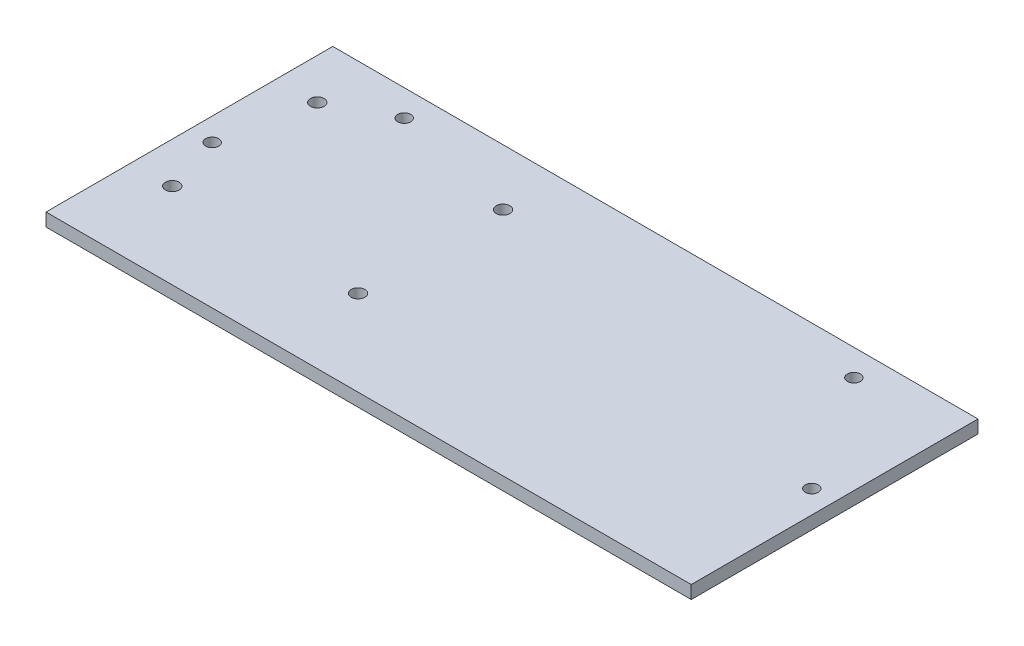
ISO-10303-21;
HEADER;
FILE_DESCRIPTION(('STEP AP214'),'2;1');
FILE_NAME('part.step','',(''),(''),'','','');
FILE_SCHEMA(('AUTOMOTIVE_DESIGN { 1 0 10303 214 1 1 1 1 }'));
ENDSEC;
DATA;
#1=APPLICATION_CONTEXT('core data for automotive mechanical design processes');
#2=APPLICATION_PROTOCOL_DEFINITION('international standard','automotive_design',2000,#1);
#3=PRODUCT_CONTEXT('',#1,'mechanical');
#4=PRODUCT('Part','Part','',(#3));
#5=PRODUCT_RELATED_PRODUCT_CATEGORY('part','',(#4));
#6=PRODUCT_DEFINITION_FORMATION('','',#4);
#7=PRODUCT_DEFINITION_CONTEXT('part definition',#1,'design');
#8=PRODUCT_DEFINITION('design','',#6,#7);
#9=PRODUCT_DEFINITION_SHAPE('','',#8);
#10=(LENGTH_UNIT() NAMED_UNIT(*) SI_UNIT(.MILLI.,.METRE.));
#11=(NAMED_UNIT(*) PLANE_ANGLE_UNIT() SI_UNIT($,.RADIAN.));
#12=(NAMED_UNIT(*) SI_UNIT($,.STERADIAN.) SOLID_ANGLE_UNIT());
#13=UNCERTAINTY_MEASURE_WITH_UNIT(LENGTH_MEASURE(1.E-05),#10,'distance_accuracy_value','');
#14=(GEOMETRIC_REPRESENTATION_CONTEXT(3) GLOBAL_UNCERTAINTY_ASSIGNED_CONTEXT((#13)) GLOBAL_UNIT_ASSIGNED_CONTEXT((#10,
#11,#12)) REPRESENTATION_CONTEXT('',''));
#15=CARTESIAN_POINT('',(0.,0.,0.));
#16=DIRECTION('',(0.,0.,1.));
#17=DIRECTION('',(1.,0.,0.));
#18=AXIS2_PLACEMENT_3D('',#15,#16,#17);
#19=CARTESIAN_POINT('',(0.,4.,0.));
#20=DIRECTION('',(1.,0.,0.));
#21=DIRECTION('',(0.,0.,-1.));
#22=AXIS2_PLACEMENT_3D('',#19,#20,#21);
#23=PLANE('',#22);
#24=DIRECTION('',(0.,0.,1.));
#25=VECTOR('',#24,1.);
#26=CARTESIAN_POINT('',(0.,0.,0.));
#27=LINE('',#26,#25);
#28=CARTESIAN_POINT('',(0.,0.,-88.));
#29=VERTEX_POINT('',#28);
#30=CARTESIAN_POINT('',(0.,0.,0.));
#31=VERTEX_POINT('',#30);
#32=EDGE_CURVE('E109',#29,#31,#27,.T.);
#33=ORIENTED_EDGE('',*,*,#32,.T.);
#34=DIRECTION('',(0.,-1.,0.));
#35=VECTOR('',#34,1.);
#36=CARTESIAN_POINT('',(0.,4.,0.));
#37=LINE('',#36,#35);
#38=CARTESIAN_POINT('',(0.,4.,0.));
#39=VERTEX_POINT('',#38);
#40=EDGE_CURVE('E13',#39,#31,#37,.T.);
#41=ORIENTED_EDGE('',*,*,#40,.F.);
#42=DIRECTION('',(0.,0.,1.));
#43=VECTOR('',#42,1.);
#44=CARTESIAN_POINT('',(0.,4.,0.));
#45=LINE('',#44,#43);
#46=CARTESIAN_POINT('',(0.,4.,-88.));
#47=VERTEX_POINT('',#46);
#48=EDGE_CURVE('E97',#47,#39,#45,.T.);
#49=ORIENTED_EDGE('',*,*,#48,.F.);
#50=DIRECTION('',(0.,-1.,0.));
#51=VECTOR('',#50,1.);
#52=CARTESIAN_POINT('',(0.,4.,-88.));
#53=LINE('',#52,#51);
#54=EDGE_CURVE('E105',#47,#29,#53,.T.);
#55=ORIENTED_EDGE('',*,*,#54,.T.);
#56=EDGE_LOOP('',(#33,#41,#49,#55));
#57=FACE_BOUND('',#56,.T.);
#58=ADVANCED_FACE('F46',(#57),#23,.F.);
#59=CARTESIAN_POINT('',(0.,4.,0.));
#60=DIRECTION('',(0.,0.,-1.));
#61=DIRECTION('',(-1.,0.,0.));
#62=AXIS2_PLACEMENT_3D('',#59,#60,#61);
#63=PLANE('',#62);
#64=DIRECTION('',(1.,0.,0.));
#65=VECTOR('',#64,1.);
#66=CARTESIAN_POINT('',(0.,0.,0.));
#67=LINE('',#66,#65);
#68=CARTESIAN_POINT('',(198.,0.,0.));
#69=VERTEX_POINT('',#68);
#70=EDGE_CURVE('E101',#31,#69,#67,.T.);
#71=ORIENTED_EDGE('',*,*,#70,.T.);
#72=DIRECTION('',(0.,-1.,0.));
#73=VECTOR('',#72,1.);
#74=CARTESIAN_POINT('',(198.,4.,0.));
#75=LINE('',#74,#73);
#76=CARTESIAN_POINT('',(198.,4.,0.));
#77=VERTEX_POINT('',#76);
#78=EDGE_CURVE('E54',#77,#69,#75,.T.);
#79=ORIENTED_EDGE('',*,*,#78,.F.);
#80=DIRECTION('',(1.,0.,0.));
#81=VECTOR('',#80,1.);
#82=CARTESIAN_POINT('',(0.,4.,0.));
#83=LINE('',#82,#81);
#84=EDGE_CURVE('E92',#39,#77,#83,.T.);
#85=ORIENTED_EDGE('',*,*,#84,.F.);
#86=ORIENTED_EDGE('',*,*,#40,.T.);
#87=EDGE_LOOP('',(#71,#79,#85,#86));
#88=FACE_BOUND('',#87,.T.);
#89=ADVANCED_FACE('F100',(#88),#63,.F.);
#90=CARTESIAN_POINT('',(198.,4.,0.));
#91=DIRECTION('',(-1.,0.,0.));
#92=DIRECTION('',(0.,0.,1.));
#93=AXIS2_PLACEMENT_3D('',#90,#91,#92);
#94=PLANE('',#93);
#95=DIRECTION('',(0.,0.,-1.));
#96=VECTOR('',#95,1.);
#97=CARTESIAN_POINT('',(198.,0.,0.));
#98=LINE('',#97,#96);
#99=CARTESIAN_POINT('',(198.,0.,-88.));
#100=VERTEX_POINT('',#99);
#101=EDGE_CURVE('E79',#69,#100,#98,.T.);
#102=ORIENTED_EDGE('',*,*,#101,.T.);
#103=DIRECTION('',(0.,-1.,0.));
#104=VECTOR('',#103,1.);
#105=CARTESIAN_POINT('',(198.,4.,-88.));
#106=LINE('',#105,#104);
#107=CARTESIAN_POINT('',(198.,4.,-88.));
#108=VERTEX_POINT('',#107);
#109=EDGE_CURVE('E102',#108,#100,#106,.T.);
#110=ORIENTED_EDGE('',*,*,#109,.F.);
#111=DIRECTION('',(0.,0.,-1.));
#112=VECTOR('',#111,1.);
#113=CARTESIAN_POINT('',(198.,4.,0.));
#114=LINE('',#113,#112);
#115=EDGE_CURVE('E95',#77,#108,#114,.T.);
#116=ORIENTED_EDGE('',*,*,#115,.F.);
#117=ORIENTED_EDGE('',*,*,#78,.T.);
#118=EDGE_LOOP('',(#102,#110,#116,#117));
#119=FACE_BOUND('',#118,.T.);
#120=ADVANCED_FACE('F103',(#119),#94,.F.);
#121=CARTESIAN_POINT('',(0.,4.,-88.));
#122=DIRECTION('',(0.,0.,1.));
#123=DIRECTION('',(1.,0.,0.));
#124=AXIS2_PLACEMENT_3D('',#121,#122,#123);
#125=PLANE('',#124);
#126=DIRECTION('',(-1.,0.,0.));
#127=VECTOR('',#126,1.);
#128=CARTESIAN_POINT('',(0.,0.,-88.));
#129=LINE('',#128,#127);
#130=EDGE_CURVE('E85',#100,#29,#129,.T.);
#131=ORIENTED_EDGE('',*,*,#130,.T.);
#132=ORIENTED_EDGE('',*,*,#54,.F.);
#133=DIRECTION('',(-1.,0.,0.));
#134=VECTOR('',#133,1.);
#135=CARTESIAN_POINT('',(0.,4.,-88.));
#136=LINE('',#135,#134);
#137=EDGE_CURVE('E62',#108,#47,#136,.T.);
#138=ORIENTED_EDGE('',*,*,#137,.F.);
#139=ORIENTED_EDGE('',*,*,#109,.T.);
#140=EDGE_LOOP('',(#131,#132,#138,#139));
#141=FACE_BOUND('',#140,.T.);
#142=ADVANCED_FACE('F117',(#141),#125,.F.);
#143=CARTESIAN_POINT('',(0.,4.,0.));
#144=DIRECTION('',(0.,-1.,0.));
#145=DIRECTION('',(0.,0.,-1.));
#146=AXIS2_PLACEMENT_3D('',#143,#144,#145);
#147=PLANE('',#146);
#148=CARTESIAN_POINT('',(191.,4.,-44.));
#149=DIRECTION('',(0.,-1.,0.));
#150=DIRECTION('',(0.,0.,-1.));
#151=AXIS2_PLACEMENT_3D('',#148,#149,#150);
#152=CIRCLE('',#151,2.);
#153=CARTESIAN_POINT('',(191.,4.,-46.));
#154=VERTEX_POINT('',#153);
#155=EDGE_CURVE('E164',#154,#154,#152,.T.);
#156=ORIENTED_EDGE('',*,*,#155,.T.);
#157=EDGE_LOOP('',(#156));
#158=FACE_BOUND('',#157,.T.);
#159=CARTESIAN_POINT('',(7.,4.,-44.));
#160=DIRECTION('',(0.,-1.,0.));
#161=DIRECTION('',(0.,0.,-1.));
#162=AXIS2_PLACEMENT_3D('',#159,#160,#161);
#163=CIRCLE('',#162,2.00000000000001);
#164=CARTESIAN_POINT('',(7.,4.,-46.));
#165=VERTEX_POINT('',#164);
#166=EDGE_CURVE('E158',#165,#165,#163,.T.);
#167=ORIENTED_EDGE('',*,*,#166,.T.);
#168=EDGE_LOOP('',(#167));
#169=FACE_BOUND('',#168,.T.);
#170=CARTESIAN_POINT('',(168.,4.,-79.9153384304878));
#171=DIRECTION('',(0.,-1.,0.));
#172=DIRECTION('',(0.,0.,-1.));
#173=AXIS2_PLACEMENT_3D('',#170,#171,#172);
#174=CIRCLE('',#173,2.);
#175=CARTESIAN_POINT('',(168.,4.,-81.9153384304878));
#176=VERTEX_POINT('',#175);
#177=EDGE_CURVE('E152',#176,#176,#174,.T.);
#178=ORIENTED_EDGE('',*,*,#177,.T.);
#179=EDGE_LOOP('',(#178));
#180=FACE_BOUND('',#179,.T.);
#181=CARTESIAN_POINT('',(30.,4.,-79.9153384304878));
#182=DIRECTION('',(0.,-1.,0.));
#183=DIRECTION('',(0.,0.,-1.));
#184=AXIS2_PLACEMENT_3D('',#181,#182,#183);
#185=CIRCLE('',#184,2.);
#186=CARTESIAN_POINT('',(30.,4.,-81.9153384304878));
#187=VERTEX_POINT('',#186);
#188=EDGE_CURVE('E133',#187,#187,#185,.T.);
#189=ORIENTED_EDGE('',*,*,#188,.T.);
#190=EDGE_LOOP('',(#189));
#191=FACE_BOUND('',#190,.T.);
#192=CARTESIAN_POINT('',(69.5,4.,-26.25));
#193=DIRECTION('',(0.,-1.,0.));
#194=DIRECTION('',(0.,0.,-1.));
#195=AXIS2_PLACEMENT_3D('',#192,#193,#194);
#196=CIRCLE('',#195,2.09999999999999);
#197=CARTESIAN_POINT('',(69.5,4.,-28.35));
#198=VERTEX_POINT('',#197);
#199=EDGE_CURVE('E126',#198,#198,#196,.T.);
#200=ORIENTED_EDGE('',*,*,#199,.T.);
#201=EDGE_LOOP('',(#200));
#202=FACE_BOUND('',#201,.T.);
#203=CARTESIAN_POINT('',(69.5,4.,-70.75));
#204=DIRECTION('',(0.,-1.,0.));
#205=DIRECTION('',(0.,0.,-1.));
#206=AXIS2_PLACEMENT_3D('',#203,#204,#205);
#207=CIRCLE('',#206,2.09999999999999);
#208=CARTESIAN_POINT('',(69.5,4.,-72.85));
#209=VERTEX_POINT('',#208);
#210=EDGE_CURVE('E139',#209,#209,#207,.T.);
#211=ORIENTED_EDGE('',*,*,#210,.T.);
#212=EDGE_LOOP('',(#211));
#213=FACE_BOUND('',#212,.T.);
#214=CARTESIAN_POINT('',(12.5,4.,-70.75));
#215=DIRECTION('',(0.,-1.,0.));
#216=DIRECTION('',(0.,0.,-1.));
#217=AXIS2_PLACEMENT_3D('',#214,#215,#216);
#218=CIRCLE('',#217,2.1);
#219=CARTESIAN_POINT('',(12.5,4.,-72.85));
#220=VERTEX_POINT('',#219);
#221=EDGE_CURVE('E132',#220,#220,#218,.T.);
#222=ORIENTED_EDGE('',*,*,#221,.T.);
#223=EDGE_LOOP('',(#222));
#224=FACE_BOUND('',#223,.T.);
#225=CARTESIAN_POINT('',(12.5,4.,-26.25));
#226=DIRECTION('',(0.,-1.,0.));
#227=DIRECTION('',(0.,0.,-1.));
#228=AXIS2_PLACEMENT_3D('',#225,#226,#227);
#229=CIRCLE('',#228,2.1);
#230=CARTESIAN_POINT('',(12.5,4.,-28.35));
#231=VERTEX_POINT('',#230);
#232=EDGE_CURVE('E112',#231,#231,#229,.T.);
#233=ORIENTED_EDGE('',*,*,#232,.T.);
#234=EDGE_LOOP('',(#233));
#235=FACE_BOUND('',#234,.T.);
#236=ORIENTED_EDGE('',*,*,#48,.T.);
#237=ORIENTED_EDGE('',*,*,#84,.T.);
#238=ORIENTED_EDGE('',*,*,#115,.T.);
#239=ORIENTED_EDGE('',*,*,#137,.T.);
#240=EDGE_LOOP('',(#236,#237,#238,#239));
#241=FACE_BOUND('',#240,.T.);
#242=ADVANCED_FACE('F93',(#158,#169,#180,#191,#202,#213,#224,#235,#241),#147,.F.);
#243=CARTESIAN_POINT('',(0.,0.,0.));
#244=DIRECTION('',(0.,-1.,0.));
#245=DIRECTION('',(0.,0.,-1.));
#246=AXIS2_PLACEMENT_3D('',#243,#244,#245);
#247=PLANE('',#246);
#248=CARTESIAN_POINT('',(191.,0.,-44.));
#249=DIRECTION('',(0.,-1.,0.));
#250=DIRECTION('',(0.,0.,-1.));
#251=AXIS2_PLACEMENT_3D('',#248,#249,#250);
#252=CIRCLE('',#251,2.);
#253=CARTESIAN_POINT('',(191.,0.,-46.));
#254=VERTEX_POINT('',#253);
#255=EDGE_CURVE('E167',#254,#254,#252,.T.);
#256=ORIENTED_EDGE('',*,*,#255,.F.);
#257=EDGE_LOOP('',(#256));
#258=FACE_BOUND('',#257,.T.);
#259=CARTESIAN_POINT('',(7.,0.,-44.));
#260=DIRECTION('',(0.,-1.,0.));
#261=DIRECTION('',(0.,0.,-1.));
#262=AXIS2_PLACEMENT_3D('',#259,#260,#261);
#263=CIRCLE('',#262,2.00000000000001);
#264=CARTESIAN_POINT('',(7.,0.,-46.));
#265=VERTEX_POINT('',#264);
#266=EDGE_CURVE('E161',#265,#265,#263,.T.);
#267=ORIENTED_EDGE('',*,*,#266,.F.);
#268=EDGE_LOOP('',(#267));
#269=FACE_BOUND('',#268,.T.);
#270=CARTESIAN_POINT('',(168.,0.,-79.9153384304878));
#271=DIRECTION('',(0.,-1.,0.));
#272=DIRECTION('',(0.,0.,-1.));
#273=AXIS2_PLACEMENT_3D('',#270,#271,#272);
#274=CIRCLE('',#273,2.);
#275=CARTESIAN_POINT('',(168.,0.,-81.9153384304878));
#276=VERTEX_POINT('',#275);
#277=EDGE_CURVE('E155',#276,#276,#274,.T.);
#278=ORIENTED_EDGE('',*,*,#277,.F.);
#279=EDGE_LOOP('',(#278));
#280=FACE_BOUND('',#279,.T.);
#281=CARTESIAN_POINT('',(30.,0.,-79.9153384304878));
#282=DIRECTION('',(0.,-1.,0.));
#283=DIRECTION('',(0.,0.,-1.));
#284=AXIS2_PLACEMENT_3D('',#281,#282,#283);
#285=CIRCLE('',#284,2.);
#286=CARTESIAN_POINT('',(30.,0.,-81.9153384304878));
#287=VERTEX_POINT('',#286);
#288=EDGE_CURVE('E149',#287,#287,#285,.T.);
#289=ORIENTED_EDGE('',*,*,#288,.F.);
#290=EDGE_LOOP('',(#289));
#291=FACE_BOUND('',#290,.T.);
#292=CARTESIAN_POINT('',(69.5,0.,-26.25));
#293=DIRECTION('',(0.,-1.,0.));
#294=DIRECTION('',(0.,0.,-1.));
#295=AXIS2_PLACEMENT_3D('',#292,#293,#294);
#296=CIRCLE('',#295,2.09999999999999);
#297=CARTESIAN_POINT('',(69.5,0.,-28.35));
#298=VERTEX_POINT('',#297);
#299=EDGE_CURVE('E142',#298,#298,#296,.T.);
#300=ORIENTED_EDGE('',*,*,#299,.F.);
#301=EDGE_LOOP('',(#300));
#302=FACE_BOUND('',#301,.T.);
#303=CARTESIAN_POINT('',(69.5,0.,-70.75));
#304=DIRECTION('',(0.,-1.,0.));
#305=DIRECTION('',(0.,0.,-1.));
#306=AXIS2_PLACEMENT_3D('',#303,#304,#305);
#307=CIRCLE('',#306,2.09999999999999);
#308=CARTESIAN_POINT('',(69.5,0.,-72.85));
#309=VERTEX_POINT('',#308);
#310=EDGE_CURVE('E136',#309,#309,#307,.T.);
#311=ORIENTED_EDGE('',*,*,#310,.F.);
#312=EDGE_LOOP('',(#311));
#313=FACE_BOUND('',#312,.T.);
#314=CARTESIAN_POINT('',(12.5,0.,-70.75));
#315=DIRECTION('',(0.,-1.,0.));
#316=DIRECTION('',(0.,0.,-1.));
#317=AXIS2_PLACEMENT_3D('',#314,#315,#316);
#318=CIRCLE('',#317,2.1);
#319=CARTESIAN_POINT('',(12.5,0.,-72.85));
#320=VERTEX_POINT('',#319);
#321=EDGE_CURVE('E129',#320,#320,#318,.T.);
#322=ORIENTED_EDGE('',*,*,#321,.F.);
#323=EDGE_LOOP('',(#322));
#324=FACE_BOUND('',#323,.T.);
#325=CARTESIAN_POINT('',(12.5,0.,-26.25));
#326=DIRECTION('',(0.,-1.,0.));
#327=DIRECTION('',(0.,0.,-1.));
#328=AXIS2_PLACEMENT_3D('',#325,#326,#327);
#329=CIRCLE('',#328,2.1);
#330=CARTESIAN_POINT('',(12.5,0.,-28.35));
#331=VERTEX_POINT('',#330);
#332=EDGE_CURVE('E123',#331,#331,#329,.T.);
#333=ORIENTED_EDGE('',*,*,#332,.F.);
#334=EDGE_LOOP('',(#333));
#335=FACE_BOUND('',#334,.T.);
#336=ORIENTED_EDGE('',*,*,#32,.F.);
#337=ORIENTED_EDGE('',*,*,#130,.F.);
#338=ORIENTED_EDGE('',*,*,#101,.F.);
#339=ORIENTED_EDGE('',*,*,#70,.F.);
#340=EDGE_LOOP('',(#336,#337,#338,#339));
#341=FACE_BOUND('',#340,.T.);
#342=ADVANCED_FACE('F120',(#258,#269,#280,#291,#302,#313,#324,#335,#341),#247,.T.);
#343=CARTESIAN_POINT('',(12.5,4.,-26.25));
#344=DIRECTION('',(0.,-1.,0.));
#345=DIRECTION('',(0.,0.,-1.));
#346=AXIS2_PLACEMENT_3D('',#343,#344,#345);
#347=CYLINDRICAL_SURFACE('',#346,2.1);
#348=ORIENTED_EDGE('',*,*,#232,.F.);
#349=EDGE_LOOP('',(#348));
#350=FACE_BOUND('',#349,.T.);
#351=ORIENTED_EDGE('',*,*,#332,.T.);
#352=EDGE_LOOP('',(#351));
#353=FACE_BOUND('',#352,.T.);
#354=ADVANCED_FACE('F176',(#350,#353),#347,.F.);
#355=CARTESIAN_POINT('',(12.5,4.,-70.75));
#356=DIRECTION('',(0.,-1.,0.));
#357=DIRECTION('',(0.,0.,-1.));
#358=AXIS2_PLACEMENT_3D('',#355,#356,#357);
#359=CYLINDRICAL_SURFACE('',#358,2.1);
#360=ORIENTED_EDGE('',*,*,#221,.F.);
#361=EDGE_LOOP('',(#360));
#362=FACE_BOUND('',#361,.T.);
#363=ORIENTED_EDGE('',*,*,#321,.T.);
#364=EDGE_LOOP('',(#363));
#365=FACE_BOUND('',#364,.T.);
#366=ADVANCED_FACE('F193',(#362,#365),#359,.F.);
#367=CARTESIAN_POINT('',(69.5,4.,-70.75));
#368=DIRECTION('',(0.,-1.,0.));
#369=DIRECTION('',(0.,0.,-1.));
#370=AXIS2_PLACEMENT_3D('',#367,#368,#369);
#371=CYLINDRICAL_SURFACE('',#370,2.09999999999999);
#372=ORIENTED_EDGE('',*,*,#210,.F.);
#373=EDGE_LOOP('',(#372));
#374=FACE_BOUND('',#373,.T.);
#375=ORIENTED_EDGE('',*,*,#310,.T.);
#376=EDGE_LOOP('',(#375));
#377=FACE_BOUND('',#376,.T.);
#378=ADVANCED_FACE('F199',(#374,#377),#371,.F.);
#379=CARTESIAN_POINT('',(69.5,4.,-26.25));
#380=DIRECTION('',(0.,-1.,0.));
#381=DIRECTION('',(0.,0.,-1.));
#382=AXIS2_PLACEMENT_3D('',#379,#380,#381);
#383=CYLINDRICAL_SURFACE('',#382,2.09999999999999);
#384=ORIENTED_EDGE('',*,*,#199,.F.);
#385=EDGE_LOOP('',(#384));
#386=FACE_BOUND('',#385,.T.);
#387=ORIENTED_EDGE('',*,*,#299,.T.);
#388=EDGE_LOOP('',(#387));
#389=FACE_BOUND('',#388,.T.);
#390=ADVANCED_FACE('F236',(#386,#389),#383,.F.);
#391=CARTESIAN_POINT('',(30.,10.,-79.9153384304878));
#392=DIRECTION('',(0.,-1.,0.));
#393=DIRECTION('',(0.,0.,-1.));
#394=AXIS2_PLACEMENT_3D('',#391,#392,#393);
#395=CYLINDRICAL_SURFACE('',#394,2.);
#396=ORIENTED_EDGE('',*,*,#288,.T.);
#397=EDGE_LOOP('',(#396));
#398=FACE_BOUND('',#397,.T.);
#399=ORIENTED_EDGE('',*,*,#188,.F.);
#400=EDGE_LOOP('',(#399));
#401=FACE_BOUND('',#400,.T.);
#402=ADVANCED_FACE('F241',(#398,#401),#395,.F.);
#403=CARTESIAN_POINT('',(168.,10.,-79.9153384304878));
#404=DIRECTION('',(0.,-1.,0.));
#405=DIRECTION('',(0.,0.,-1.));
#406=AXIS2_PLACEMENT_3D('',#403,#404,#405);
#407=CYLINDRICAL_SURFACE('',#406,2.);
#408=ORIENTED_EDGE('',*,*,#277,.T.);
#409=EDGE_LOOP('',(#408));
#410=FACE_BOUND('',#409,.T.);
#411=ORIENTED_EDGE('',*,*,#177,.F.);
#412=EDGE_LOOP('',(#411));
#413=FACE_BOUND('',#412,.T.);
#414=ADVANCED_FACE('F247',(#410,#413),#407,.F.);
#415=CARTESIAN_POINT('',(7.,25.,-44.));
#416=DIRECTION('',(0.,-1.,0.));
#417=DIRECTION('',(0.,0.,-1.));
#418=AXIS2_PLACEMENT_3D('',#415,#416,#417);
#419=CYLINDRICAL_SURFACE('',#418,2.00000000000001);
#420=ORIENTED_EDGE('',*,*,#266,.T.);
#421=EDGE_LOOP('',(#420));
#422=FACE_BOUND('',#421,.T.);
#423=ORIENTED_EDGE('',*,*,#166,.F.);
#424=EDGE_LOOP('',(#423));
#425=FACE_BOUND('',#424,.T.);
#426=ADVANCED_FACE('F251',(#422,#425),#419,.F.);
#427=CARTESIAN_POINT('',(191.,25.,-44.));
#428=DIRECTION('',(0.,-1.,0.));
#429=DIRECTION('',(0.,0.,-1.));
#430=AXIS2_PLACEMENT_3D('',#427,#428,#429);
#431=CYLINDRICAL_SURFACE('',#430,2.);
#432=ORIENTED_EDGE('',*,*,#255,.T.);
#433=EDGE_LOOP('',(#432));
#434=FACE_BOUND('',#433,.T.);
#435=ORIENTED_EDGE('',*,*,#155,.F.);
#436=EDGE_LOOP('',(#435));
#437=FACE_BOUND('',#436,.T.);
#438=ADVANCED_FACE('F171',(#434,#437),#431,.F.);
#439=CLOSED_SHELL('',(#58,#89,#120,#142,#242,#342,#354,#366,#378,#390,#402,#414,#426,#438));
#440=MANIFOLD_SOLID_BREP('B2',#439);
#441=ADVANCED_BREP_SHAPE_REPRESENTATION('',(#18,#440),#14);
#442=SHAPE_DEFINITION_REPRESENTATION(#9,#441);
ENDSEC;
END-ISO-10303-21;
